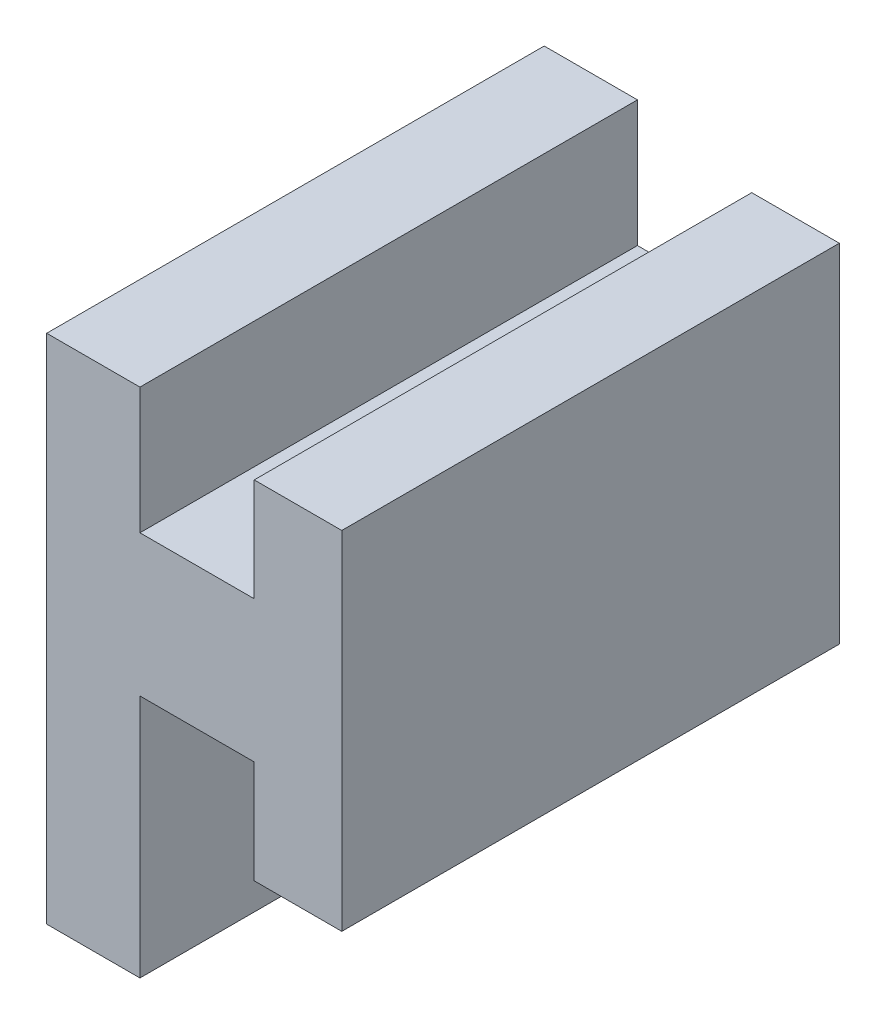
ISO-10303-21;
HEADER;
FILE_DESCRIPTION(('STEP AP214'),'2;1');
FILE_NAME('part.step','',(''),(''),'','','');
FILE_SCHEMA(('AUTOMOTIVE_DESIGN { 1 0 10303 214 1 1 1 1 }'));
ENDSEC;
DATA;
#1=APPLICATION_CONTEXT('core data for automotive mechanical design processes');
#2=APPLICATION_PROTOCOL_DEFINITION('international standard','automotive_design',2000,#1);
#3=PRODUCT_CONTEXT('',#1,'mechanical');
#4=PRODUCT('Part','Part','',(#3));
#5=PRODUCT_RELATED_PRODUCT_CATEGORY('part','',(#4));
#6=PRODUCT_DEFINITION_FORMATION('','',#4);
#7=PRODUCT_DEFINITION_CONTEXT('part definition',#1,'design');
#8=PRODUCT_DEFINITION('design','',#6,#7);
#9=PRODUCT_DEFINITION_SHAPE('','',#8);
#10=(LENGTH_UNIT() NAMED_UNIT(*) SI_UNIT(.MILLI.,.METRE.));
#11=(NAMED_UNIT(*) PLANE_ANGLE_UNIT() SI_UNIT($,.RADIAN.));
#12=(NAMED_UNIT(*) SI_UNIT($,.STERADIAN.) SOLID_ANGLE_UNIT());
#13=UNCERTAINTY_MEASURE_WITH_UNIT(LENGTH_MEASURE(1.E-05),#10,'distance_accuracy_value','');
#14=(GEOMETRIC_REPRESENTATION_CONTEXT(3) GLOBAL_UNCERTAINTY_ASSIGNED_CONTEXT((#13)) GLOBAL_UNIT_ASSIGNED_CONTEXT((#10,
#11,#12)) REPRESENTATION_CONTEXT('',''));
#15=CARTESIAN_POINT('',(0.,0.,0.));
#16=DIRECTION('',(0.,0.,1.));
#17=DIRECTION('',(1.,0.,0.));
#18=AXIS2_PLACEMENT_3D('',#15,#16,#17);
#19=CARTESIAN_POINT('',(-33.994430758815,-9.65302384075596,-10.));
#20=DIRECTION('',(0.,1.,0.));
#21=DIRECTION('',(0.,0.,1.));
#22=AXIS2_PLACEMENT_3D('',#19,#20,#21);
#23=PLANE('',#22);
#24=DIRECTION('',(-1.,0.,0.));
#25=VECTOR('',#24,1.);
#26=CARTESIAN_POINT('',(-33.994430758815,-9.65302384075596,0.));
#27=LINE('',#26,#25);
#28=CARTESIAN_POINT('',(-32.1199999999999,-9.65302384075596,0.));
#29=VERTEX_POINT('',#28);
#30=CARTESIAN_POINT('',(-33.994430758815,-9.65302384075596,0.));
#31=VERTEX_POINT('',#30);
#32=EDGE_CURVE('E154',#29,#31,#27,.T.);
#33=ORIENTED_EDGE('',*,*,#32,.F.);
#34=DIRECTION('',(0.,0.,1.));
#35=VECTOR('',#34,1.);
#36=CARTESIAN_POINT('',(-32.1199999999999,-9.65302384075596,-10.));
#37=LINE('',#36,#35);
#38=CARTESIAN_POINT('',(-32.1199999999999,-9.65302384075596,-10.));
#39=VERTEX_POINT('',#38);
#40=EDGE_CURVE('E11',#39,#29,#37,.T.);
#41=ORIENTED_EDGE('',*,*,#40,.F.);
#42=DIRECTION('',(-1.,0.,0.));
#43=VECTOR('',#42,1.);
#44=CARTESIAN_POINT('',(-33.994430758815,-9.65302384075596,-10.));
#45=LINE('',#44,#43);
#46=CARTESIAN_POINT('',(-33.994430758815,-9.65302384075596,-10.));
#47=VERTEX_POINT('',#46);
#48=EDGE_CURVE('E186',#39,#47,#45,.T.);
#49=ORIENTED_EDGE('',*,*,#48,.T.);
#50=DIRECTION('',(0.,0.,1.));
#51=VECTOR('',#50,1.);
#52=CARTESIAN_POINT('',(-33.994430758815,-9.65302384075596,-10.));
#53=LINE('',#52,#51);
#54=EDGE_CURVE('E36',#47,#31,#53,.T.);
#55=ORIENTED_EDGE('',*,*,#54,.T.);
#56=EDGE_LOOP('',(#33,#41,#49,#55));
#57=FACE_BOUND('',#56,.T.);
#58=ADVANCED_FACE('F33',(#57),#23,.T.);
#59=CARTESIAN_POINT('',(-32.1199999999999,-9.65302384075596,-10.));
#60=DIRECTION('',(1.,0.,0.));
#61=DIRECTION('',(0.,0.,-1.));
#62=AXIS2_PLACEMENT_3D('',#59,#60,#61);
#63=PLANE('',#62);
#64=DIRECTION('',(0.,1.,0.));
#65=VECTOR('',#64,1.);
#66=CARTESIAN_POINT('',(-32.1199999999999,-9.65302384075596,0.));
#67=LINE('',#66,#65);
#68=CARTESIAN_POINT('',(-32.1199999999999,-12.1892177220203,0.));
#69=VERTEX_POINT('',#68);
#70=EDGE_CURVE('E184',#69,#29,#67,.T.);
#71=ORIENTED_EDGE('',*,*,#70,.F.);
#72=DIRECTION('',(0.,0.,1.));
#73=VECTOR('',#72,1.);
#74=CARTESIAN_POINT('',(-32.1199999999999,-12.1892177220203,-10.));
#75=LINE('',#74,#73);
#76=CARTESIAN_POINT('',(-32.1199999999999,-12.1892177220203,-10.));
#77=VERTEX_POINT('',#76);
#78=EDGE_CURVE('E42',#77,#69,#75,.T.);
#79=ORIENTED_EDGE('',*,*,#78,.F.);
#80=DIRECTION('',(0.,1.,0.));
#81=VECTOR('',#80,1.);
#82=CARTESIAN_POINT('',(-32.1199999999999,-9.65302384075596,-10.));
#83=LINE('',#82,#81);
#84=EDGE_CURVE('E144',#77,#39,#83,.T.);
#85=ORIENTED_EDGE('',*,*,#84,.T.);
#86=ORIENTED_EDGE('',*,*,#40,.T.);
#87=EDGE_LOOP('',(#71,#79,#85,#86));
#88=FACE_BOUND('',#87,.T.);
#89=ADVANCED_FACE('F206',(#88),#63,.T.);
#90=CARTESIAN_POINT('',(-32.1199999999999,-12.1892177220203,-10.));
#91=DIRECTION('',(0.,1.,0.));
#92=DIRECTION('',(0.,0.,1.));
#93=AXIS2_PLACEMENT_3D('',#90,#91,#92);
#94=PLANE('',#93);
#95=DIRECTION('',(-1.,0.,0.));
#96=VECTOR('',#95,1.);
#97=CARTESIAN_POINT('',(-32.1199999999999,-12.1892177220203,0.));
#98=LINE('',#97,#96);
#99=CARTESIAN_POINT('',(-29.8227979056844,-12.1892177220203,0.));
#100=VERTEX_POINT('',#99);
#101=EDGE_CURVE('E131',#100,#69,#98,.T.);
#102=ORIENTED_EDGE('',*,*,#101,.F.);
#103=DIRECTION('',(0.,0.,1.));
#104=VECTOR('',#103,1.);
#105=CARTESIAN_POINT('',(-29.8227979056844,-12.1892177220203,-10.));
#106=LINE('',#105,#104);
#107=CARTESIAN_POINT('',(-29.8227979056844,-12.1892177220203,-10.));
#108=VERTEX_POINT('',#107);
#109=EDGE_CURVE('E126',#108,#100,#106,.T.);
#110=ORIENTED_EDGE('',*,*,#109,.F.);
#111=DIRECTION('',(-1.,0.,0.));
#112=VECTOR('',#111,1.);
#113=CARTESIAN_POINT('',(-32.1199999999999,-12.1892177220203,-10.));
#114=LINE('',#113,#112);
#115=EDGE_CURVE('E129',#108,#77,#114,.T.);
#116=ORIENTED_EDGE('',*,*,#115,.T.);
#117=ORIENTED_EDGE('',*,*,#78,.T.);
#118=EDGE_LOOP('',(#102,#110,#116,#117));
#119=FACE_BOUND('',#118,.T.);
#120=ADVANCED_FACE('F128',(#119),#94,.T.);
#121=CARTESIAN_POINT('',(-29.8227979056844,-12.1892177220203,-10.));
#122=DIRECTION('',(-1.,0.,0.));
#123=DIRECTION('',(0.,0.,1.));
#124=AXIS2_PLACEMENT_3D('',#121,#122,#123);
#125=PLANE('',#124);
#126=DIRECTION('',(0.,-1.,0.));
#127=VECTOR('',#126,1.);
#128=CARTESIAN_POINT('',(-29.8227979056844,-12.1892177220203,0.));
#129=LINE('',#128,#127);
#130=CARTESIAN_POINT('',(-29.8227979056844,-10.12,0.));
#131=VERTEX_POINT('',#130);
#132=EDGE_CURVE('E181',#131,#100,#129,.T.);
#133=ORIENTED_EDGE('',*,*,#132,.F.);
#134=DIRECTION('',(0.,0.,1.));
#135=VECTOR('',#134,1.);
#136=CARTESIAN_POINT('',(-29.8227979056844,-10.12,-10.));
#137=LINE('',#136,#135);
#138=CARTESIAN_POINT('',(-29.8227979056844,-10.12,-10.));
#139=VERTEX_POINT('',#138);
#140=EDGE_CURVE('E136',#139,#131,#137,.T.);
#141=ORIENTED_EDGE('',*,*,#140,.F.);
#142=DIRECTION('',(0.,-1.,0.));
#143=VECTOR('',#142,1.);
#144=CARTESIAN_POINT('',(-29.8227979056844,-12.1892177220203,-10.));
#145=LINE('',#144,#143);
#146=EDGE_CURVE('E142',#139,#108,#145,.T.);
#147=ORIENTED_EDGE('',*,*,#146,.T.);
#148=ORIENTED_EDGE('',*,*,#109,.T.);
#149=EDGE_LOOP('',(#133,#141,#147,#148));
#150=FACE_BOUND('',#149,.T.);
#151=ADVANCED_FACE('F146',(#150),#125,.T.);
#152=CARTESIAN_POINT('',(-29.8227979056844,-10.12,-10.));
#153=DIRECTION('',(0.,1.,0.));
#154=DIRECTION('',(0.,0.,1.));
#155=AXIS2_PLACEMENT_3D('',#152,#153,#154);
#156=PLANE('',#155);
#157=DIRECTION('',(-1.,0.,0.));
#158=VECTOR('',#157,1.);
#159=CARTESIAN_POINT('',(-29.8227979056844,-10.12,0.));
#160=LINE('',#159,#158);
#161=CARTESIAN_POINT('',(-28.0627979056844,-10.12,0.));
#162=VERTEX_POINT('',#161);
#163=EDGE_CURVE('E178',#162,#131,#160,.T.);
#164=ORIENTED_EDGE('',*,*,#163,.F.);
#165=DIRECTION('',(0.,0.,1.));
#166=VECTOR('',#165,1.);
#167=CARTESIAN_POINT('',(-28.0627979056844,-10.12,-10.));
#168=LINE('',#167,#166);
#169=CARTESIAN_POINT('',(-28.0627979056844,-10.12,-10.));
#170=VERTEX_POINT('',#169);
#171=EDGE_CURVE('E190',#170,#162,#168,.T.);
#172=ORIENTED_EDGE('',*,*,#171,.F.);
#173=DIRECTION('',(-1.,0.,0.));
#174=VECTOR('',#173,1.);
#175=CARTESIAN_POINT('',(-29.8227979056844,-10.12,-10.));
#176=LINE('',#175,#174);
#177=EDGE_CURVE('E147',#170,#139,#176,.T.);
#178=ORIENTED_EDGE('',*,*,#177,.T.);
#179=ORIENTED_EDGE('',*,*,#140,.T.);
#180=EDGE_LOOP('',(#164,#172,#178,#179));
#181=FACE_BOUND('',#180,.T.);
#182=ADVANCED_FACE('F219',(#181),#156,.T.);
#183=CARTESIAN_POINT('',(-28.0627979056844,-10.12,-10.));
#184=DIRECTION('',(1.,0.,0.));
#185=DIRECTION('',(0.,0.,-1.));
#186=AXIS2_PLACEMENT_3D('',#183,#184,#185);
#187=PLANE('',#186);
#188=DIRECTION('',(0.,1.,0.));
#189=VECTOR('',#188,1.);
#190=CARTESIAN_POINT('',(-28.0627979056844,-10.12,0.));
#191=LINE('',#190,#189);
#192=CARTESIAN_POINT('',(-28.0627979056844,-17.0988691741385,0.));
#193=VERTEX_POINT('',#192);
#194=EDGE_CURVE('E175',#193,#162,#191,.T.);
#195=ORIENTED_EDGE('',*,*,#194,.F.);
#196=DIRECTION('',(0.,0.,1.));
#197=VECTOR('',#196,1.);
#198=CARTESIAN_POINT('',(-28.0627979056844,-17.0988691741385,-10.));
#199=LINE('',#198,#197);
#200=CARTESIAN_POINT('',(-28.0627979056844,-17.0988691741385,-10.));
#201=VERTEX_POINT('',#200);
#202=EDGE_CURVE('E192',#201,#193,#199,.T.);
#203=ORIENTED_EDGE('',*,*,#202,.F.);
#204=DIRECTION('',(0.,1.,0.));
#205=VECTOR('',#204,1.);
#206=CARTESIAN_POINT('',(-28.0627979056844,-10.12,-10.));
#207=LINE('',#206,#205);
#208=EDGE_CURVE('E149',#201,#170,#207,.T.);
#209=ORIENTED_EDGE('',*,*,#208,.T.);
#210=ORIENTED_EDGE('',*,*,#171,.T.);
#211=EDGE_LOOP('',(#195,#203,#209,#210));
#212=FACE_BOUND('',#211,.T.);
#213=ADVANCED_FACE('F222',(#212),#187,.T.);
#214=CARTESIAN_POINT('',(-28.0627979056844,-17.0988691741385,-10.));
#215=DIRECTION('',(0.,-1.,0.));
#216=DIRECTION('',(0.,0.,-1.));
#217=AXIS2_PLACEMENT_3D('',#214,#215,#216);
#218=PLANE('',#217);
#219=DIRECTION('',(1.,0.,0.));
#220=VECTOR('',#219,1.);
#221=CARTESIAN_POINT('',(-28.0627979056844,-17.0988691741385,0.));
#222=LINE('',#221,#220);
#223=CARTESIAN_POINT('',(-29.8227979056844,-17.0988691741385,0.));
#224=VERTEX_POINT('',#223);
#225=EDGE_CURVE('E172',#224,#193,#222,.T.);
#226=ORIENTED_EDGE('',*,*,#225,.F.);
#227=DIRECTION('',(0.,0.,1.));
#228=VECTOR('',#227,1.);
#229=CARTESIAN_POINT('',(-29.8227979056844,-17.0988691741385,-10.));
#230=LINE('',#229,#228);
#231=CARTESIAN_POINT('',(-29.8227979056844,-17.0988691741385,-10.));
#232=VERTEX_POINT('',#231);
#233=EDGE_CURVE('E194',#232,#224,#230,.T.);
#234=ORIENTED_EDGE('',*,*,#233,.F.);
#235=DIRECTION('',(1.,0.,0.));
#236=VECTOR('',#235,1.);
#237=CARTESIAN_POINT('',(-28.0627979056844,-17.0988691741385,-10.));
#238=LINE('',#237,#236);
#239=EDGE_CURVE('E348',#232,#201,#238,.T.);
#240=ORIENTED_EDGE('',*,*,#239,.T.);
#241=ORIENTED_EDGE('',*,*,#202,.T.);
#242=EDGE_LOOP('',(#226,#234,#240,#241));
#243=FACE_BOUND('',#242,.T.);
#244=ADVANCED_FACE('F226',(#243),#218,.T.);
#245=CARTESIAN_POINT('',(-29.8227979056844,-17.0988691741385,-10.));
#246=DIRECTION('',(-1.,0.,0.));
#247=DIRECTION('',(0.,0.,1.));
#248=AXIS2_PLACEMENT_3D('',#245,#246,#247);
#249=PLANE('',#248);
#250=DIRECTION('',(0.,-1.,0.));
#251=VECTOR('',#250,1.);
#252=CARTESIAN_POINT('',(-29.8227979056844,-17.0988691741385,0.));
#253=LINE('',#252,#251);
#254=CARTESIAN_POINT('',(-29.8227979056844,-15.0296514521183,0.));
#255=VERTEX_POINT('',#254);
#256=EDGE_CURVE('E169',#255,#224,#253,.T.);
#257=ORIENTED_EDGE('',*,*,#256,.F.);
#258=DIRECTION('',(0.,0.,1.));
#259=VECTOR('',#258,1.);
#260=CARTESIAN_POINT('',(-29.8227979056844,-15.0296514521183,-10.));
#261=LINE('',#260,#259);
#262=CARTESIAN_POINT('',(-29.8227979056844,-15.0296514521183,-10.));
#263=VERTEX_POINT('',#262);
#264=EDGE_CURVE('E196',#263,#255,#261,.T.);
#265=ORIENTED_EDGE('',*,*,#264,.F.);
#266=DIRECTION('',(0.,-1.,0.));
#267=VECTOR('',#266,1.);
#268=CARTESIAN_POINT('',(-29.8227979056844,-17.0988691741385,-10.));
#269=LINE('',#268,#267);
#270=EDGE_CURVE('E352',#263,#232,#269,.T.);
#271=ORIENTED_EDGE('',*,*,#270,.T.);
#272=ORIENTED_EDGE('',*,*,#233,.T.);
#273=EDGE_LOOP('',(#257,#265,#271,#272));
#274=FACE_BOUND('',#273,.T.);
#275=ADVANCED_FACE('F230',(#274),#249,.T.);
#276=CARTESIAN_POINT('',(-29.8227979056844,-15.0296514521183,-10.));
#277=DIRECTION('',(0.,-1.,0.));
#278=DIRECTION('',(0.,0.,-1.));
#279=AXIS2_PLACEMENT_3D('',#276,#277,#278);
#280=PLANE('',#279);
#281=DIRECTION('',(1.,0.,0.));
#282=VECTOR('',#281,1.);
#283=CARTESIAN_POINT('',(-29.8227979056844,-15.0296514521183,0.));
#284=LINE('',#283,#282);
#285=CARTESIAN_POINT('',(-32.12,-15.0296514521183,0.));
#286=VERTEX_POINT('',#285);
#287=EDGE_CURVE('E166',#286,#255,#284,.T.);
#288=ORIENTED_EDGE('',*,*,#287,.F.);
#289=DIRECTION('',(0.,0.,1.));
#290=VECTOR('',#289,1.);
#291=CARTESIAN_POINT('',(-32.12,-15.0296514521183,-10.));
#292=LINE('',#291,#290);
#293=CARTESIAN_POINT('',(-32.12,-15.0296514521183,-10.));
#294=VERTEX_POINT('',#293);
#295=EDGE_CURVE('E198',#294,#286,#292,.T.);
#296=ORIENTED_EDGE('',*,*,#295,.F.);
#297=DIRECTION('',(1.,0.,0.));
#298=VECTOR('',#297,1.);
#299=CARTESIAN_POINT('',(-29.8227979056844,-15.0296514521183,-10.));
#300=LINE('',#299,#298);
#301=EDGE_CURVE('E341',#294,#263,#300,.T.);
#302=ORIENTED_EDGE('',*,*,#301,.T.);
#303=ORIENTED_EDGE('',*,*,#264,.T.);
#304=EDGE_LOOP('',(#288,#296,#302,#303));
#305=FACE_BOUND('',#304,.T.);
#306=ADVANCED_FACE('F234',(#305),#280,.T.);
#307=CARTESIAN_POINT('',(-32.12,-15.0296514521183,-10.));
#308=DIRECTION('',(1.,0.,0.));
#309=DIRECTION('',(0.,0.,-1.));
#310=AXIS2_PLACEMENT_3D('',#307,#308,#309);
#311=PLANE('',#310);
#312=DIRECTION('',(0.,1.,0.));
#313=VECTOR('',#312,1.);
#314=CARTESIAN_POINT('',(-32.12,-15.0296514521183,0.));
#315=LINE('',#314,#313);
#316=CARTESIAN_POINT('',(-32.12,-19.9389821765482,0.));
#317=VERTEX_POINT('',#316);
#318=EDGE_CURVE('E163',#317,#286,#315,.T.);
#319=ORIENTED_EDGE('',*,*,#318,.F.);
#320=DIRECTION('',(0.,0.,1.));
#321=VECTOR('',#320,1.);
#322=CARTESIAN_POINT('',(-32.12,-19.9389821765482,-10.));
#323=LINE('',#322,#321);
#324=CARTESIAN_POINT('',(-32.12,-19.9389821765482,-10.));
#325=VERTEX_POINT('',#324);
#326=EDGE_CURVE('E200',#325,#317,#323,.T.);
#327=ORIENTED_EDGE('',*,*,#326,.F.);
#328=DIRECTION('',(0.,1.,0.));
#329=VECTOR('',#328,1.);
#330=CARTESIAN_POINT('',(-32.12,-15.0296514521183,-10.));
#331=LINE('',#330,#329);
#332=EDGE_CURVE('E337',#325,#294,#331,.T.);
#333=ORIENTED_EDGE('',*,*,#332,.T.);
#334=ORIENTED_EDGE('',*,*,#295,.T.);
#335=EDGE_LOOP('',(#319,#327,#333,#334));
#336=FACE_BOUND('',#335,.T.);
#337=ADVANCED_FACE('F238',(#336),#311,.T.);
#338=CARTESIAN_POINT('',(-32.12,-19.9389821765482,-10.));
#339=DIRECTION('',(0.,-1.,0.));
#340=DIRECTION('',(0.,0.,-1.));
#341=AXIS2_PLACEMENT_3D('',#338,#339,#340);
#342=PLANE('',#341);
#343=DIRECTION('',(1.,0.,0.));
#344=VECTOR('',#343,1.);
#345=CARTESIAN_POINT('',(-32.12,-19.9389821765482,0.));
#346=LINE('',#345,#344);
#347=CARTESIAN_POINT('',(-33.994430758815,-19.9389821765482,0.));
#348=VERTEX_POINT('',#347);
#349=EDGE_CURVE('E160',#348,#317,#346,.T.);
#350=ORIENTED_EDGE('',*,*,#349,.F.);
#351=DIRECTION('',(0.,0.,1.));
#352=VECTOR('',#351,1.);
#353=CARTESIAN_POINT('',(-33.994430758815,-19.9389821765482,-10.));
#354=LINE('',#353,#352);
#355=CARTESIAN_POINT('',(-33.994430758815,-19.9389821765482,-10.));
#356=VERTEX_POINT('',#355);
#357=EDGE_CURVE('E201',#356,#348,#354,.T.);
#358=ORIENTED_EDGE('',*,*,#357,.F.);
#359=DIRECTION('',(1.,0.,0.));
#360=VECTOR('',#359,1.);
#361=CARTESIAN_POINT('',(-32.12,-19.9389821765482,-10.));
#362=LINE('',#361,#360);
#363=EDGE_CURVE('E358',#356,#325,#362,.T.);
#364=ORIENTED_EDGE('',*,*,#363,.T.);
#365=ORIENTED_EDGE('',*,*,#326,.T.);
#366=EDGE_LOOP('',(#350,#358,#364,#365));
#367=FACE_BOUND('',#366,.T.);
#368=ADVANCED_FACE('F242',(#367),#342,.T.);
#369=CARTESIAN_POINT('',(-33.994430758815,-19.9389821765482,-10.));
#370=DIRECTION('',(-1.,0.,0.));
#371=DIRECTION('',(0.,0.,1.));
#372=AXIS2_PLACEMENT_3D('',#369,#370,#371);
#373=PLANE('',#372);
#374=DIRECTION('',(0.,-1.,0.));
#375=VECTOR('',#374,1.);
#376=CARTESIAN_POINT('',(-33.994430758815,-19.9389821765482,0.));
#377=LINE('',#376,#375);
#378=EDGE_CURVE('E157',#31,#348,#377,.T.);
#379=ORIENTED_EDGE('',*,*,#378,.F.);
#380=ORIENTED_EDGE('',*,*,#54,.F.);
#381=DIRECTION('',(0.,-1.,0.));
#382=VECTOR('',#381,1.);
#383=CARTESIAN_POINT('',(-33.994430758815,-19.9389821765482,-10.));
#384=LINE('',#383,#382);
#385=EDGE_CURVE('E360',#47,#356,#384,.T.);
#386=ORIENTED_EDGE('',*,*,#385,.T.);
#387=ORIENTED_EDGE('',*,*,#357,.T.);
#388=EDGE_LOOP('',(#379,#380,#386,#387));
#389=FACE_BOUND('',#388,.T.);
#390=ADVANCED_FACE('F203',(#389),#373,.T.);
#391=CARTESIAN_POINT('',(0.,0.,-10.));
#392=DIRECTION('',(0.,0.,-1.));
#393=DIRECTION('',(-1.,0.,0.));
#394=AXIS2_PLACEMENT_3D('',#391,#392,#393);
#395=PLANE('',#394);
#396=ORIENTED_EDGE('',*,*,#48,.F.);
#397=ORIENTED_EDGE('',*,*,#84,.F.);
#398=ORIENTED_EDGE('',*,*,#115,.F.);
#399=ORIENTED_EDGE('',*,*,#146,.F.);
#400=ORIENTED_EDGE('',*,*,#177,.F.);
#401=ORIENTED_EDGE('',*,*,#208,.F.);
#402=ORIENTED_EDGE('',*,*,#239,.F.);
#403=ORIENTED_EDGE('',*,*,#270,.F.);
#404=ORIENTED_EDGE('',*,*,#301,.F.);
#405=ORIENTED_EDGE('',*,*,#332,.F.);
#406=ORIENTED_EDGE('',*,*,#363,.F.);
#407=ORIENTED_EDGE('',*,*,#385,.F.);
#408=EDGE_LOOP('',(#396,#397,#398,#399,#400,#401,#402,#403,#404,#405,#406,#407));
#409=FACE_BOUND('',#408,.T.);
#410=ADVANCED_FACE('F140',(#409),#395,.T.);
#411=CARTESIAN_POINT('',(0.,0.,0.));
#412=DIRECTION('',(0.,0.,-1.));
#413=DIRECTION('',(-1.,0.,0.));
#414=AXIS2_PLACEMENT_3D('',#411,#412,#413);
#415=PLANE('',#414);
#416=ORIENTED_EDGE('',*,*,#32,.T.);
#417=ORIENTED_EDGE('',*,*,#378,.T.);
#418=ORIENTED_EDGE('',*,*,#349,.T.);
#419=ORIENTED_EDGE('',*,*,#318,.T.);
#420=ORIENTED_EDGE('',*,*,#287,.T.);
#421=ORIENTED_EDGE('',*,*,#256,.T.);
#422=ORIENTED_EDGE('',*,*,#225,.T.);
#423=ORIENTED_EDGE('',*,*,#194,.T.);
#424=ORIENTED_EDGE('',*,*,#163,.T.);
#425=ORIENTED_EDGE('',*,*,#132,.T.);
#426=ORIENTED_EDGE('',*,*,#101,.T.);
#427=ORIENTED_EDGE('',*,*,#70,.T.);
#428=EDGE_LOOP('',(#416,#417,#418,#419,#420,#421,#422,#423,#424,#425,#426,#427));
#429=FACE_BOUND('',#428,.T.);
#430=ADVANCED_FACE('F205',(#429),#415,.F.);
#431=CLOSED_SHELL('',(#58,#89,#120,#151,#182,#213,#244,#275,#306,#337,#368,#390,#410,#430));
#432=MANIFOLD_SOLID_BREP('B2',#431);
#433=ADVANCED_BREP_SHAPE_REPRESENTATION('',(#18,#432),#14);
#434=SHAPE_DEFINITION_REPRESENTATION(#9,#433);
ENDSEC;
END-ISO-10303-21;
